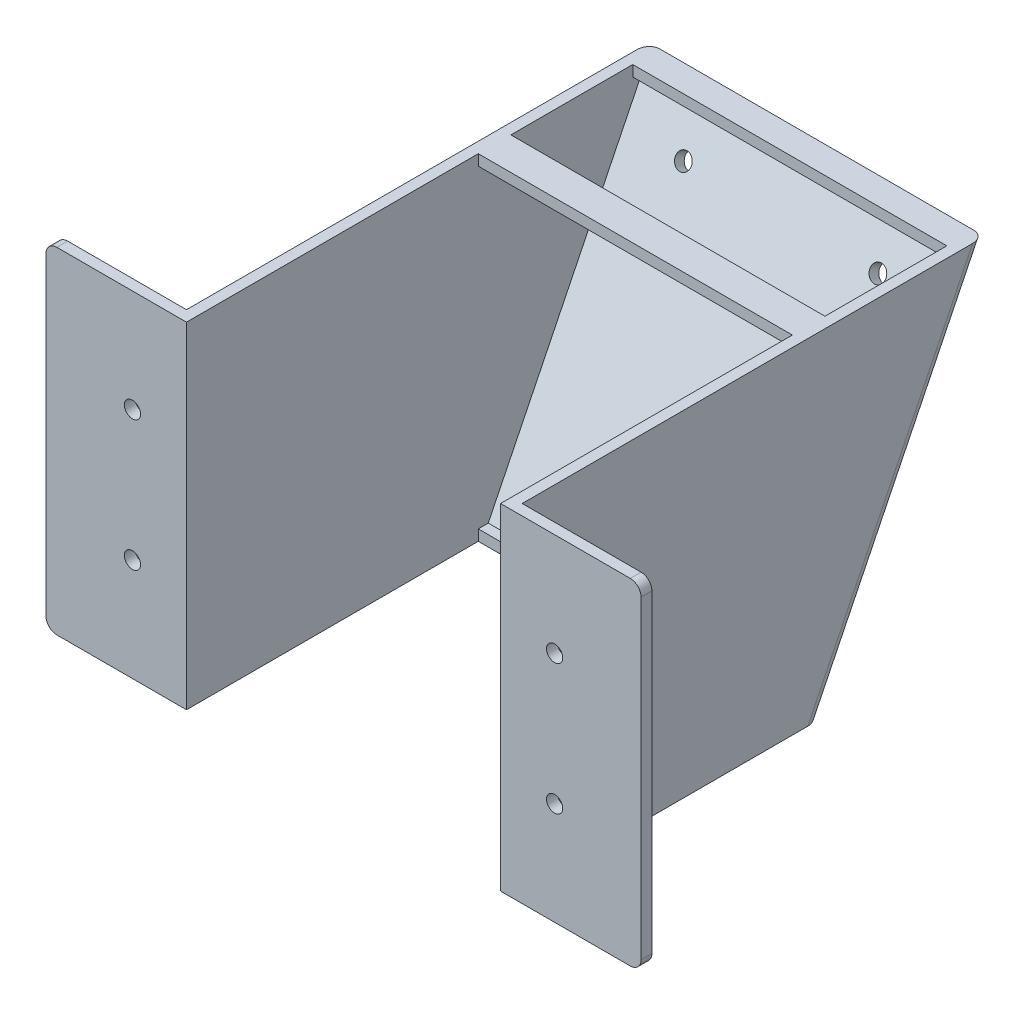
ISO-10303-21;
HEADER;
FILE_DESCRIPTION(('STEP AP214'),'2;1');
FILE_NAME('part.step','',(''),(''),'','','');
FILE_SCHEMA(('AUTOMOTIVE_DESIGN { 1 0 10303 214 1 1 1 1 }'));
ENDSEC;
DATA;
#1=APPLICATION_CONTEXT('core data for automotive mechanical design processes');
#2=APPLICATION_PROTOCOL_DEFINITION('international standard','automotive_design',2000,#1);
#3=PRODUCT_CONTEXT('',#1,'mechanical');
#4=PRODUCT('Part','Part','',(#3));
#5=PRODUCT_RELATED_PRODUCT_CATEGORY('part','',(#4));
#6=PRODUCT_DEFINITION_FORMATION('','',#4);
#7=PRODUCT_DEFINITION_CONTEXT('part definition',#1,'design');
#8=PRODUCT_DEFINITION('design','',#6,#7);
#9=PRODUCT_DEFINITION_SHAPE('','',#8);
#10=(LENGTH_UNIT() NAMED_UNIT(*) SI_UNIT(.MILLI.,.METRE.));
#11=(NAMED_UNIT(*) PLANE_ANGLE_UNIT() SI_UNIT($,.RADIAN.));
#12=(NAMED_UNIT(*) SI_UNIT($,.STERADIAN.) SOLID_ANGLE_UNIT());
#13=UNCERTAINTY_MEASURE_WITH_UNIT(LENGTH_MEASURE(1.E-05),#10,'distance_accuracy_value','');
#14=(GEOMETRIC_REPRESENTATION_CONTEXT(3) GLOBAL_UNCERTAINTY_ASSIGNED_CONTEXT((#13)) GLOBAL_UNIT_ASSIGNED_CONTEXT((#10,
#11,#12)) REPRESENTATION_CONTEXT('',''));
#15=CARTESIAN_POINT('',(0.,0.,0.));
#16=DIRECTION('',(0.,0.,1.));
#17=DIRECTION('',(1.,0.,0.));
#18=AXIS2_PLACEMENT_3D('',#15,#16,#17);
#19=CARTESIAN_POINT('',(-94.6505530644469,29.0633568734212,3.));
#20=DIRECTION('',(0.,-1.,0.));
#21=DIRECTION('',(0.,0.,-1.));
#22=AXIS2_PLACEMENT_3D('',#19,#20,#21);
#23=PLANE('',#22);
#24=DIRECTION('',(-1.,0.,0.));
#25=VECTOR('',#24,1.);
#26=CARTESIAN_POINT('',(-29.0633568734212,29.0633568734212,-25.59));
#27=LINE('',#26,#25);
#28=CARTESIAN_POINT('',(29.0633568734212,29.0633568734212,-25.59));
#29=VERTEX_POINT('',#28);
#30=CARTESIAN_POINT('',(-29.0633568734212,29.0633568734212,-25.59));
#31=VERTEX_POINT('',#30);
#32=EDGE_CURVE('E223',#29,#31,#27,.T.);
#33=ORIENTED_EDGE('',*,*,#32,.T.);
#34=DIRECTION('',(0.,0.,-1.));
#35=VECTOR('',#34,1.);
#36=CARTESIAN_POINT('',(-29.0633568734212,29.0633568734212,3.));
#37=LINE('',#36,#35);
#38=CARTESIAN_POINT('',(-29.0633568734212,29.0633568734212,-27.3803464956001));
#39=VERTEX_POINT('',#38);
#40=EDGE_CURVE('E236',#31,#39,#37,.T.);
#41=ORIENTED_EDGE('',*,*,#40,.T.);
#42=DIRECTION('',(1.,0.,0.));
#43=VECTOR('',#42,1.);
#44=CARTESIAN_POINT('',(-94.6505530644469,29.0633568734212,-27.3803464956001));
#45=LINE('',#44,#43);
#46=CARTESIAN_POINT('',(29.0633568734212,29.0633568734212,-27.3803464956001));
#47=VERTEX_POINT('',#46);
#48=EDGE_CURVE('E255',#39,#47,#45,.T.);
#49=ORIENTED_EDGE('',*,*,#48,.T.);
#50=DIRECTION('',(0.,0.,-1.));
#51=VECTOR('',#50,1.);
#52=CARTESIAN_POINT('',(29.0633568734212,29.0633568734212,3.));
#53=LINE('',#52,#51);
#54=EDGE_CURVE('E254',#29,#47,#53,.T.);
#55=ORIENTED_EDGE('',*,*,#54,.F.);
#56=EDGE_LOOP('',(#33,#41,#49,#55));
#57=FACE_BOUND('',#56,.T.);
#58=ADVANCED_FACE('F37',(#57),#23,.T.);
#59=CARTESIAN_POINT('',(0.,0.,3.));
#60=DIRECTION('',(0.,0.,-1.));
#61=DIRECTION('',(-1.,0.,0.));
#62=AXIS2_PLACEMENT_3D('',#59,#60,#61);
#63=PLANE('',#62);
#64=DIRECTION('',(1.,0.,0.));
#65=VECTOR('',#64,1.);
#66=CARTESIAN_POINT('',(-94.6505530644469,-29.0633568734212,3.));
#67=LINE('',#66,#65);
#68=CARTESIAN_POINT('',(-29.0633568734212,-29.0633568734212,3.));
#69=VERTEX_POINT('',#68);
#70=CARTESIAN_POINT('',(29.0633568734212,-29.0633568734212,3.));
#71=VERTEX_POINT('',#70);
#72=EDGE_CURVE('E251',#69,#71,#67,.T.);
#73=ORIENTED_EDGE('',*,*,#72,.F.);
#74=DIRECTION('',(0.,-1.,0.));
#75=VECTOR('',#74,1.);
#76=CARTESIAN_POINT('',(-29.0633568734212,-31.0633568734212,3.));
#77=LINE('',#76,#75);
#78=CARTESIAN_POINT('',(-29.0633568734212,-31.0633568734212,3.));
#79=VERTEX_POINT('',#78);
#80=EDGE_CURVE('E328',#69,#79,#77,.T.);
#81=ORIENTED_EDGE('',*,*,#80,.T.);
#82=DIRECTION('',(1.,0.,0.));
#83=VECTOR('',#82,1.);
#84=CARTESIAN_POINT('',(29.0633568734212,-31.0633568734212,3.));
#85=LINE('',#84,#83);
#86=CARTESIAN_POINT('',(29.0633568734212,-31.0633568734212,3.));
#87=VERTEX_POINT('',#86);
#88=EDGE_CURVE('E327',#79,#87,#85,.T.);
#89=ORIENTED_EDGE('',*,*,#88,.T.);
#90=DIRECTION('',(0.,1.,0.));
#91=VECTOR('',#90,1.);
#92=CARTESIAN_POINT('',(29.0633568734212,31.0633568734212,3.));
#93=LINE('',#92,#91);
#94=EDGE_CURVE('E332',#87,#71,#93,.T.);
#95=ORIENTED_EDGE('',*,*,#94,.T.);
#96=EDGE_LOOP('',(#73,#81,#89,#95));
#97=FACE_BOUND('',#96,.T.);
#98=ADVANCED_FACE('F456',(#97),#63,.F.);
#99=DIRECTION('',(1.,0.,0.));
#100=VECTOR('',#99,1.);
#101=CARTESIAN_POINT('',(-94.6505530644469,29.0633568734212,3.));
#102=LINE('',#101,#100);
#103=CARTESIAN_POINT('',(-29.0633568734212,29.0633568734212,3.));
#104=VERTEX_POINT('',#103);
#105=CARTESIAN_POINT('',(29.0633568734212,29.0633568734212,3.));
#106=VERTEX_POINT('',#105);
#107=EDGE_CURVE('E234',#104,#106,#102,.T.);
#108=ORIENTED_EDGE('',*,*,#107,.T.);
#109=CARTESIAN_POINT('',(29.0633568734212,31.0633568734212,3.));
#110=VERTEX_POINT('',#109);
#111=EDGE_CURVE('E331',#106,#110,#93,.T.);
#112=ORIENTED_EDGE('',*,*,#111,.T.);
#113=DIRECTION('',(-1.,0.,0.));
#114=VECTOR('',#113,1.);
#115=CARTESIAN_POINT('',(-29.0633568734212,31.0633568734212,3.));
#116=LINE('',#115,#114);
#117=CARTESIAN_POINT('',(-29.0633568734212,31.0633568734212,3.));
#118=VERTEX_POINT('',#117);
#119=EDGE_CURVE('E335',#110,#118,#116,.T.);
#120=ORIENTED_EDGE('',*,*,#119,.T.);
#121=EDGE_CURVE('E325',#118,#104,#77,.T.);
#122=ORIENTED_EDGE('',*,*,#121,.T.);
#123=EDGE_LOOP('',(#108,#112,#120,#122));
#124=FACE_BOUND('',#123,.T.);
#125=ADVANCED_FACE('F462',(#124),#63,.F.);
#126=CARTESIAN_POINT('',(-18.,-17.606648794129,4.43956609068005));
#127=DIRECTION('',(0.,-0.440632808345781,-0.897687433469641));
#128=DIRECTION('',(0.,0.897687433469641,-0.440632808345781));
#129=AXIS2_PLACEMENT_3D('',#126,#127,#128);
#130=CYLINDRICAL_SURFACE('',#129,1.5);
#131=CARTESIAN_POINT('',(-18.,-22.0129768775868,-4.53730824401636));
#132=DIRECTION('',(0.,-0.440632808345781,-0.897687433469641));
#133=DIRECTION('',(0.,0.897687433469641,-0.440632808345781));
#134=AXIS2_PLACEMENT_3D('',#131,#132,#133);
#135=CIRCLE('',#134,1.5);
#136=CARTESIAN_POINT('',(-18.,-20.6664457273823,-5.19825745653503));
#137=VERTEX_POINT('',#136);
#138=EDGE_CURVE('E277',#137,#137,#135,.T.);
#139=ORIENTED_EDGE('',*,*,#138,.T.);
#140=EDGE_LOOP('',(#139));
#141=FACE_BOUND('',#140,.T.);
#142=CARTESIAN_POINT('',(-18.,-21.1317112608952,-2.74193337707708));
#143=DIRECTION('',(0.,0.440632808345781,0.897687433469641));
#144=DIRECTION('',(0.,-0.897687433469641,0.440632808345781));
#145=AXIS2_PLACEMENT_3D('',#142,#143,#144);
#146=CIRCLE('',#145,1.5);
#147=CARTESIAN_POINT('',(-18.,-22.4782424110997,-2.0809841645584));
#148=VERTEX_POINT('',#147);
#149=EDGE_CURVE('E267',#148,#148,#146,.F.);
#150=ORIENTED_EDGE('',*,*,#149,.F.);
#151=EDGE_LOOP('',(#150));
#152=FACE_BOUND('',#151,.T.);
#153=ADVANCED_FACE('F488',(#141,#152),#130,.F.);
#154=CARTESIAN_POINT('',(18.,25.4823480124138,-16.7108087099174));
#155=DIRECTION('',(0.,-0.440632808345781,-0.897687433469641));
#156=DIRECTION('',(0.,0.897687433469641,-0.440632808345781));
#157=AXIS2_PLACEMENT_3D('',#154,#155,#156);
#158=CYLINDRICAL_SURFACE('',#157,1.5);
#159=CARTESIAN_POINT('',(18.,21.076019928956,-25.6876830446138));
#160=DIRECTION('',(0.,-0.440632808345781,-0.897687433469641));
#161=DIRECTION('',(0.,-0.897687433469641,0.440632808345781));
#162=AXIS2_PLACEMENT_3D('',#159,#160,#161);
#163=CIRCLE('',#162,1.5);
#164=CARTESIAN_POINT('',(18.,19.7294887787515,-25.0267338320952));
#165=VERTEX_POINT('',#164);
#166=EDGE_CURVE('E270',#165,#165,#163,.T.);
#167=ORIENTED_EDGE('',*,*,#166,.T.);
#168=EDGE_LOOP('',(#167));
#169=FACE_BOUND('',#168,.T.);
#170=CARTESIAN_POINT('',(18.,21.9572855456475,-23.8923081776746));
#171=DIRECTION('',(0.,0.440632808345781,0.897687433469641));
#172=DIRECTION('',(0.,-0.897687433469641,0.440632808345781));
#173=AXIS2_PLACEMENT_3D('',#170,#171,#172);
#174=CIRCLE('',#173,1.5);
#175=CARTESIAN_POINT('',(18.,20.6107543954431,-23.2313589651559));
#176=VERTEX_POINT('',#175);
#177=EDGE_CURVE('E264',#176,#176,#174,.F.);
#178=ORIENTED_EDGE('',*,*,#177,.F.);
#179=EDGE_LOOP('',(#178));
#180=FACE_BOUND('',#179,.T.);
#181=ADVANCED_FACE('F484',(#169,#180),#158,.F.);
#182=CARTESIAN_POINT('',(-18.,25.4823480124138,-16.7108087099174));
#183=DIRECTION('',(0.,-0.440632808345781,-0.897687433469641));
#184=DIRECTION('',(0.,0.897687433469641,-0.440632808345781));
#185=AXIS2_PLACEMENT_3D('',#182,#183,#184);
#186=CYLINDRICAL_SURFACE('',#185,1.5);
#187=CARTESIAN_POINT('',(-18.,21.076019928956,-25.6876830446138));
#188=DIRECTION('',(0.,-0.440632808345781,-0.897687433469641));
#189=DIRECTION('',(0.,0.897687433469641,-0.440632808345781));
#190=AXIS2_PLACEMENT_3D('',#187,#188,#189);
#191=CIRCLE('',#190,1.5);
#192=CARTESIAN_POINT('',(-18.,22.4225510791604,-26.3486322571325));
#193=VERTEX_POINT('',#192);
#194=EDGE_CURVE('E273',#193,#193,#191,.T.);
#195=ORIENTED_EDGE('',*,*,#194,.T.);
#196=EDGE_LOOP('',(#195));
#197=FACE_BOUND('',#196,.T.);
#198=CARTESIAN_POINT('',(-18.,21.9572855456475,-23.8923081776746));
#199=DIRECTION('',(0.,0.440632808345781,0.897687433469641));
#200=DIRECTION('',(0.,-0.897687433469641,0.440632808345781));
#201=AXIS2_PLACEMENT_3D('',#198,#199,#200);
#202=CIRCLE('',#201,1.5);
#203=CARTESIAN_POINT('',(-18.,20.6107543954431,-23.2313589651559));
#204=VERTEX_POINT('',#203);
#205=EDGE_CURVE('E239',#204,#204,#202,.F.);
#206=ORIENTED_EDGE('',*,*,#205,.F.);
#207=EDGE_LOOP('',(#206));
#208=FACE_BOUND('',#207,.T.);
#209=ADVANCED_FACE('F487',(#197,#208),#186,.F.);
#210=CARTESIAN_POINT('',(18.,-17.606648794129,4.43956609068005));
#211=DIRECTION('',(0.,-0.440632808345781,-0.897687433469641));
#212=DIRECTION('',(0.,0.897687433469641,-0.440632808345781));
#213=AXIS2_PLACEMENT_3D('',#210,#211,#212);
#214=CYLINDRICAL_SURFACE('',#213,1.5);
#215=CARTESIAN_POINT('',(18.,-22.0129768775868,-4.53730824401636));
#216=DIRECTION('',(0.,-0.440632808345781,-0.897687433469641));
#217=DIRECTION('',(0.,-0.897687433469641,0.440632808345781));
#218=AXIS2_PLACEMENT_3D('',#215,#216,#217);
#219=CIRCLE('',#218,1.5);
#220=CARTESIAN_POINT('',(18.,-23.3595080277913,-3.87635903149769));
#221=VERTEX_POINT('',#220);
#222=EDGE_CURVE('E274',#221,#221,#219,.T.);
#223=ORIENTED_EDGE('',*,*,#222,.T.);
#224=EDGE_LOOP('',(#223));
#225=FACE_BOUND('',#224,.T.);
#226=CARTESIAN_POINT('',(18.,-21.1317112608952,-2.74193337707708));
#227=DIRECTION('',(0.,0.440632808345781,0.897687433469641));
#228=DIRECTION('',(0.,-0.897687433469641,0.440632808345781));
#229=AXIS2_PLACEMENT_3D('',#226,#227,#228);
#230=CIRCLE('',#229,1.5);
#231=CARTESIAN_POINT('',(18.,-22.4782424110997,-2.08098416455841));
#232=VERTEX_POINT('',#231);
#233=EDGE_CURVE('E235',#232,#232,#230,.F.);
#234=ORIENTED_EDGE('',*,*,#233,.F.);
#235=EDGE_LOOP('',(#234));
#236=FACE_BOUND('',#235,.T.);
#237=ADVANCED_FACE('F490',(#225,#236),#214,.F.);
#238=CARTESIAN_POINT('',(-31.0633568734212,31.0633568734212,57.));
#239=DIRECTION('',(1.,0.,0.));
#240=DIRECTION('',(0.,0.,-1.));
#241=AXIS2_PLACEMENT_3D('',#238,#239,#240);
#242=PLANE('',#241);
#243=DIRECTION('',(0.,0.,-1.));
#244=VECTOR('',#243,1.);
#245=CARTESIAN_POINT('',(-31.0633568734212,31.0633568734212,57.));
#246=LINE('',#245,#244);
#247=CARTESIAN_POINT('',(-31.0633568734212,31.0633568734212,55.));
#248=VERTEX_POINT('',#247);
#249=CARTESIAN_POINT('',(-31.0633568734212,31.0633568734212,-28.3620530271101));
#250=VERTEX_POINT('',#249);
#251=EDGE_CURVE('E363',#248,#250,#246,.T.);
#252=ORIENTED_EDGE('',*,*,#251,.T.);
#253=DIRECTION('',(0.,-0.897687433469641,0.440632808345781));
#254=VECTOR('',#253,1.);
#255=CARTESIAN_POINT('',(-31.0633568734212,-2.70164885533545,-11.7883896969142));
#256=LINE('',#255,#254);
#257=CARTESIAN_POINT('',(-31.0633568734212,-31.0633568734212,2.13304730615246));
#258=VERTEX_POINT('',#257);
#259=EDGE_CURVE('E415',#250,#258,#256,.T.);
#260=ORIENTED_EDGE('',*,*,#259,.T.);
#261=DIRECTION('',(0.,0.,-1.));
#262=VECTOR('',#261,1.);
#263=CARTESIAN_POINT('',(-31.0633568734212,-31.0633568734212,57.));
#264=LINE('',#263,#262);
#265=CARTESIAN_POINT('',(-31.0633568734212,-31.0633568734212,55.));
#266=VERTEX_POINT('',#265);
#267=EDGE_CURVE('E360',#266,#258,#264,.T.);
#268=ORIENTED_EDGE('',*,*,#267,.F.);
#269=DIRECTION('',(0.,-1.,0.));
#270=VECTOR('',#269,1.);
#271=CARTESIAN_POINT('',(-31.0633568734212,-31.0633568734212,55.));
#272=LINE('',#271,#270);
#273=EDGE_CURVE('E302',#248,#266,#272,.T.);
#274=ORIENTED_EDGE('',*,*,#273,.F.);
#275=EDGE_LOOP('',(#252,#260,#268,#274));
#276=FACE_BOUND('',#275,.T.);
#277=ADVANCED_FACE('F444',(#276),#242,.F.);
#278=CARTESIAN_POINT('',(31.0633568734212,31.0633568734212,57.));
#279=DIRECTION('',(-1.,0.,0.));
#280=DIRECTION('',(0.,0.,1.));
#281=AXIS2_PLACEMENT_3D('',#278,#279,#280);
#282=PLANE('',#281);
#283=DIRECTION('',(0.,0.,-1.));
#284=VECTOR('',#283,1.);
#285=CARTESIAN_POINT('',(31.0633568734212,-31.0633568734212,57.));
#286=LINE('',#285,#284);
#287=CARTESIAN_POINT('',(31.0633568734212,-31.0633568734212,55.));
#288=VERTEX_POINT('',#287);
#289=CARTESIAN_POINT('',(31.0633568734212,-31.0633568734212,2.13304730615247));
#290=VERTEX_POINT('',#289);
#291=EDGE_CURVE('E358',#288,#290,#286,.T.);
#292=ORIENTED_EDGE('',*,*,#291,.T.);
#293=DIRECTION('',(0.,-0.897687433469641,0.440632808345781));
#294=VECTOR('',#293,1.);
#295=CARTESIAN_POINT('',(31.0633568734212,-2.70164885533545,-11.7883896969142));
#296=LINE('',#295,#294);
#297=CARTESIAN_POINT('',(31.0633568734212,31.0633568734212,-28.3620530271101));
#298=VERTEX_POINT('',#297);
#299=EDGE_CURVE('E45',#290,#298,#296,.F.);
#300=ORIENTED_EDGE('',*,*,#299,.T.);
#301=DIRECTION('',(0.,0.,-1.));
#302=VECTOR('',#301,1.);
#303=CARTESIAN_POINT('',(31.0633568734212,31.0633568734212,57.));
#304=LINE('',#303,#302);
#305=CARTESIAN_POINT('',(31.0633568734212,31.0633568734212,55.));
#306=VERTEX_POINT('',#305);
#307=EDGE_CURVE('E366',#306,#298,#304,.T.);
#308=ORIENTED_EDGE('',*,*,#307,.F.);
#309=DIRECTION('',(0.,1.,0.));
#310=VECTOR('',#309,1.);
#311=CARTESIAN_POINT('',(31.0633568734212,31.0633568734212,55.));
#312=LINE('',#311,#310);
#313=EDGE_CURVE('E312',#288,#306,#312,.T.);
#314=ORIENTED_EDGE('',*,*,#313,.F.);
#315=EDGE_LOOP('',(#292,#300,#308,#314));
#316=FACE_BOUND('',#315,.T.);
#317=ADVANCED_FACE('F552',(#316),#282,.F.);
#318=CARTESIAN_POINT('',(0.,0.,57.));
#319=DIRECTION('',(0.,0.,1.));
#320=DIRECTION('',(1.,0.,0.));
#321=AXIS2_PLACEMENT_3D('',#318,#319,#320);
#322=PLANE('',#321);
#323=CARTESIAN_POINT('',(-39.0633568734212,12.0633568734212,57.));
#324=DIRECTION('',(0.,0.,1.));
#325=DIRECTION('',(-1.,0.,0.));
#326=AXIS2_PLACEMENT_3D('',#323,#324,#325);
#327=CIRCLE('',#326,1.5);
#328=CARTESIAN_POINT('',(-40.5633568734212,12.0633568734212,57.));
#329=VERTEX_POINT('',#328);
#330=EDGE_CURVE('E290',#329,#329,#327,.T.);
#331=ORIENTED_EDGE('',*,*,#330,.F.);
#332=EDGE_LOOP('',(#331));
#333=FACE_BOUND('',#332,.T.);
#334=CARTESIAN_POINT('',(-39.0633568734212,-12.0633568734212,57.));
#335=DIRECTION('',(0.,0.,1.));
#336=DIRECTION('',(1.,0.,0.));
#337=AXIS2_PLACEMENT_3D('',#334,#335,#336);
#338=CIRCLE('',#337,1.5);
#339=CARTESIAN_POINT('',(-37.5633568734212,-12.0633568734212,57.));
#340=VERTEX_POINT('',#339);
#341=EDGE_CURVE('E286',#340,#340,#338,.T.);
#342=ORIENTED_EDGE('',*,*,#341,.F.);
#343=EDGE_LOOP('',(#342));
#344=FACE_BOUND('',#343,.T.);
#345=DIRECTION('',(-1.,0.,0.));
#346=VECTOR('',#345,1.);
#347=CARTESIAN_POINT('',(-31.0633568734212,31.0633568734212,57.));
#348=LINE('',#347,#346);
#349=CARTESIAN_POINT('',(-29.0633568734212,31.0633568734212,57.));
#350=VERTEX_POINT('',#349);
#351=CARTESIAN_POINT('',(-53.0633568734212,31.0633568734212,57.));
#352=VERTEX_POINT('',#351);
#353=EDGE_CURVE('E345',#350,#352,#348,.T.);
#354=ORIENTED_EDGE('',*,*,#353,.T.);
#355=CARTESIAN_POINT('',(-53.0633568734212,29.0633568734212,57.));
#356=DIRECTION('',(0.,0.,1.));
#357=DIRECTION('',(1.,0.,0.));
#358=AXIS2_PLACEMENT_3D('',#355,#356,#357);
#359=CIRCLE('',#358,2.);
#360=CARTESIAN_POINT('',(-55.0633568734212,29.0633568734212,57.));
#361=VERTEX_POINT('',#360);
#362=EDGE_CURVE('E414',#352,#361,#359,.T.);
#363=ORIENTED_EDGE('',*,*,#362,.T.);
#364=DIRECTION('',(0.,1.,0.));
#365=VECTOR('',#364,1.);
#366=CARTESIAN_POINT('',(-55.0633568734212,31.0633568734212,57.));
#367=LINE('',#366,#365);
#368=CARTESIAN_POINT('',(-55.0633568734212,-29.0633568734212,57.));
#369=VERTEX_POINT('',#368);
#370=EDGE_CURVE('E301',#369,#361,#367,.T.);
#371=ORIENTED_EDGE('',*,*,#370,.F.);
#372=CARTESIAN_POINT('',(-53.0633568734212,-29.0633568734212,57.));
#373=DIRECTION('',(0.,0.,1.));
#374=DIRECTION('',(1.,0.,0.));
#375=AXIS2_PLACEMENT_3D('',#372,#373,#374);
#376=CIRCLE('',#375,2.);
#377=CARTESIAN_POINT('',(-53.0633568734212,-31.0633568734212,57.));
#378=VERTEX_POINT('',#377);
#379=EDGE_CURVE('E400',#369,#378,#376,.T.);
#380=ORIENTED_EDGE('',*,*,#379,.T.);
#381=DIRECTION('',(1.,0.,0.));
#382=VECTOR('',#381,1.);
#383=CARTESIAN_POINT('',(-31.0633568734212,-31.0633568734212,57.));
#384=LINE('',#383,#382);
#385=CARTESIAN_POINT('',(-29.0633568734212,-31.0633568734212,57.));
#386=VERTEX_POINT('',#385);
#387=EDGE_CURVE('E356',#378,#386,#384,.T.);
#388=ORIENTED_EDGE('',*,*,#387,.T.);
#389=DIRECTION('',(0.,-1.,0.));
#390=VECTOR('',#389,1.);
#391=CARTESIAN_POINT('',(-29.0633568734212,-31.0633568734212,57.));
#392=LINE('',#391,#390);
#393=EDGE_CURVE('E324',#350,#386,#392,.T.);
#394=ORIENTED_EDGE('',*,*,#393,.F.);
#395=EDGE_LOOP('',(#354,#363,#371,#380,#388,#394));
#396=FACE_BOUND('',#395,.T.);
#397=ADVANCED_FACE('F547',(#333,#344,#396),#322,.T.);
#398=CARTESIAN_POINT('',(-31.0633568734212,31.0633568734212,57.));
#399=DIRECTION('',(0.,-1.,0.));
#400=DIRECTION('',(0.,0.,-1.));
#401=AXIS2_PLACEMENT_3D('',#398,#399,#400);
#402=PLANE('',#401);
#403=DIRECTION('',(1.,0.,0.));
#404=VECTOR('',#403,1.);
#405=CARTESIAN_POINT('',(29.0633568734212,31.0633568734212,-3.03020841788992));
#406=LINE('',#405,#404);
#407=CARTESIAN_POINT('',(-29.0633568734212,31.0633568734212,-3.03020841788992));
#408=VERTEX_POINT('',#407);
#409=CARTESIAN_POINT('',(29.0633568734212,31.0633568734212,-3.03020841788992));
#410=VERTEX_POINT('',#409);
#411=EDGE_CURVE('E632',#408,#410,#406,.T.);
#412=ORIENTED_EDGE('',*,*,#411,.F.);
#413=DIRECTION('',(0.,0.,1.));
#414=VECTOR('',#413,1.);
#415=CARTESIAN_POINT('',(-29.0633568734212,31.0633568734212,-3.03020841788992));
#416=LINE('',#415,#414);
#417=CARTESIAN_POINT('',(-29.0633568734212,31.0633568734212,-25.59));
#418=VERTEX_POINT('',#417);
#419=EDGE_CURVE('E218',#418,#408,#416,.T.);
#420=ORIENTED_EDGE('',*,*,#419,.F.);
#421=DIRECTION('',(-1.,0.,0.));
#422=VECTOR('',#421,1.);
#423=CARTESIAN_POINT('',(-29.0633568734212,31.0633568734212,-25.59));
#424=LINE('',#423,#422);
#425=CARTESIAN_POINT('',(29.0633568734212,31.0633568734212,-25.59));
#426=VERTEX_POINT('',#425);
#427=EDGE_CURVE('E230',#426,#418,#424,.T.);
#428=ORIENTED_EDGE('',*,*,#427,.F.);
#429=DIRECTION('',(0.,0.,-1.));
#430=VECTOR('',#429,1.);
#431=CARTESIAN_POINT('',(29.0633568734212,31.0633568734212,-25.59));
#432=LINE('',#431,#430);
#433=EDGE_CURVE('E630',#410,#426,#432,.T.);
#434=ORIENTED_EDGE('',*,*,#433,.F.);
#435=EDGE_LOOP('',(#412,#420,#428,#434));
#436=FACE_BOUND('',#435,.T.);
#437=ORIENTED_EDGE('',*,*,#307,.T.);
#438=CARTESIAN_POINT('',(29.0633568734212,31.0633568734212,-28.3620530271101));
#439=DIRECTION('',(0.,-1.,0.));
#440=DIRECTION('',(0.,0.,1.));
#441=AXIS2_PLACEMENT_3D('',#438,#439,#440);
#442=ELLIPSE('',#441,2.22794697288991,2.);
#443=CARTESIAN_POINT('',(29.0633568734212,31.0633568734212,-30.59));
#444=VERTEX_POINT('',#443);
#445=EDGE_CURVE('E11',#298,#444,#442,.F.);
#446=ORIENTED_EDGE('',*,*,#445,.T.);
#447=DIRECTION('',(-1.,0.,0.));
#448=VECTOR('',#447,1.);
#449=CARTESIAN_POINT('',(-31.0633568734212,31.0633568734212,-30.59));
#450=LINE('',#449,#448);
#451=CARTESIAN_POINT('',(-29.0633568734212,31.0633568734212,-30.59));
#452=VERTEX_POINT('',#451);
#453=EDGE_CURVE('E284',#444,#452,#450,.T.);
#454=ORIENTED_EDGE('',*,*,#453,.T.);
#455=CARTESIAN_POINT('',(-29.0633568734212,31.0633568734212,-28.3620530271101));
#456=DIRECTION('',(0.,-1.,0.));
#457=DIRECTION('',(0.,0.,1.));
#458=AXIS2_PLACEMENT_3D('',#455,#456,#457);
#459=ELLIPSE('',#458,2.22794697288991,2.);
#460=EDGE_CURVE('E424',#452,#250,#459,.F.);
#461=ORIENTED_EDGE('',*,*,#460,.T.);
#462=ORIENTED_EDGE('',*,*,#251,.F.);
#463=DIRECTION('',(1.,0.,0.));
#464=VECTOR('',#463,1.);
#465=CARTESIAN_POINT('',(-55.0633568734212,31.0633568734212,55.));
#466=LINE('',#465,#464);
#467=CARTESIAN_POINT('',(-53.0633568734212,31.0633568734212,55.));
#468=VERTEX_POINT('',#467);
#469=EDGE_CURVE('E305',#468,#248,#466,.T.);
#470=ORIENTED_EDGE('',*,*,#469,.F.);
#471=DIRECTION('',(0.,0.,-1.));
#472=VECTOR('',#471,1.);
#473=CARTESIAN_POINT('',(-53.0633568734212,31.0633568734212,57.));
#474=LINE('',#473,#472);
#475=EDGE_CURVE('E412',#468,#352,#474,.F.);
#476=ORIENTED_EDGE('',*,*,#475,.T.);
#477=ORIENTED_EDGE('',*,*,#353,.F.);
#478=DIRECTION('',(0.,0.,1.));
#479=VECTOR('',#478,1.);
#480=CARTESIAN_POINT('',(-29.0633568734212,31.0633568734212,3.));
#481=LINE('',#480,#479);
#482=EDGE_CURVE('E343',#118,#350,#481,.T.);
#483=ORIENTED_EDGE('',*,*,#482,.F.);
#484=ORIENTED_EDGE('',*,*,#119,.F.);
#485=DIRECTION('',(0.,0.,1.));
#486=VECTOR('',#485,1.);
#487=CARTESIAN_POINT('',(29.0633568734212,31.0633568734212,3.));
#488=LINE('',#487,#486);
#489=CARTESIAN_POINT('',(29.0633568734212,31.0633568734212,57.));
#490=VERTEX_POINT('',#489);
#491=EDGE_CURVE('E346',#110,#490,#488,.T.);
#492=ORIENTED_EDGE('',*,*,#491,.T.);
#493=CARTESIAN_POINT('',(53.0633568734212,31.0633568734212,57.));
#494=VERTEX_POINT('',#493);
#495=EDGE_CURVE('E353',#494,#490,#348,.T.);
#496=ORIENTED_EDGE('',*,*,#495,.F.);
#497=DIRECTION('',(0.,0.,1.));
#498=VECTOR('',#497,1.);
#499=CARTESIAN_POINT('',(53.0633568734212,31.0633568734212,57.));
#500=LINE('',#499,#498);
#501=CARTESIAN_POINT('',(53.0633568734212,31.0633568734212,55.));
#502=VERTEX_POINT('',#501);
#503=EDGE_CURVE('E393',#494,#502,#500,.F.);
#504=ORIENTED_EDGE('',*,*,#503,.T.);
#505=DIRECTION('',(-1.,0.,0.));
#506=VECTOR('',#505,1.);
#507=CARTESIAN_POINT('',(55.0633568734212,31.0633568734212,55.));
#508=LINE('',#507,#506);
#509=EDGE_CURVE('E318',#502,#306,#508,.T.);
#510=ORIENTED_EDGE('',*,*,#509,.T.);
#511=EDGE_LOOP('',(#437,#446,#454,#461,#462,#470,#476,#477,#483,#484,#492,#496,#504,#510));
#512=FACE_BOUND('',#511,.T.);
#513=ADVANCED_FACE('F449',(#436,#512),#402,.F.);
#514=CARTESIAN_POINT('',(-31.0633568734212,-31.0633568734212,57.));
#515=DIRECTION('',(0.,1.,0.));
#516=DIRECTION('',(0.,0.,1.));
#517=AXIS2_PLACEMENT_3D('',#514,#515,#516);
#518=PLANE('',#517);
#519=DIRECTION('',(1.,0.,0.));
#520=VECTOR('',#519,1.);
#521=CARTESIAN_POINT('',(-31.0633568734212,-31.0633568734212,-0.0948996667374732));
#522=LINE('',#521,#520);
#523=CARTESIAN_POINT('',(-29.0633568734212,-31.0633568734212,-0.0948996667374732));
#524=VERTEX_POINT('',#523);
#525=CARTESIAN_POINT('',(29.0633568734212,-31.0633568734212,-0.0948996667374732));
#526=VERTEX_POINT('',#525);
#527=EDGE_CURVE('E282',#524,#526,#522,.T.);
#528=ORIENTED_EDGE('',*,*,#527,.T.);
#529=CARTESIAN_POINT('',(29.0633568734212,-31.0633568734212,2.13304730615245));
#530=DIRECTION('',(0.,1.,0.));
#531=DIRECTION('',(0.,0.,1.));
#532=AXIS2_PLACEMENT_3D('',#529,#530,#531);
#533=ELLIPSE('',#532,2.22794697288991,2.);
#534=EDGE_CURVE('E59',#526,#290,#533,.F.);
#535=ORIENTED_EDGE('',*,*,#534,.T.);
#536=ORIENTED_EDGE('',*,*,#291,.F.);
#537=DIRECTION('',(-1.,0.,0.));
#538=VECTOR('',#537,1.);
#539=CARTESIAN_POINT('',(55.0633568734212,-31.0633568734212,55.));
#540=LINE('',#539,#538);
#541=CARTESIAN_POINT('',(53.0633568734212,-31.0633568734212,55.));
#542=VERTEX_POINT('',#541);
#543=EDGE_CURVE('E322',#542,#288,#540,.T.);
#544=ORIENTED_EDGE('',*,*,#543,.F.);
#545=DIRECTION('',(0.,0.,-1.));
#546=VECTOR('',#545,1.);
#547=CARTESIAN_POINT('',(53.0633568734212,-31.0633568734212,57.));
#548=LINE('',#547,#546);
#549=CARTESIAN_POINT('',(53.0633568734212,-31.0633568734212,57.));
#550=VERTEX_POINT('',#549);
#551=EDGE_CURVE('E383',#542,#550,#548,.F.);
#552=ORIENTED_EDGE('',*,*,#551,.T.);
#553=CARTESIAN_POINT('',(29.0633568734212,-31.0633568734212,57.));
#554=VERTEX_POINT('',#553);
#555=EDGE_CURVE('E355',#554,#550,#384,.T.);
#556=ORIENTED_EDGE('',*,*,#555,.F.);
#557=DIRECTION('',(0.,0.,1.));
#558=VECTOR('',#557,1.);
#559=CARTESIAN_POINT('',(29.0633568734212,-31.0633568734212,3.));
#560=LINE('',#559,#558);
#561=EDGE_CURVE('E349',#87,#554,#560,.T.);
#562=ORIENTED_EDGE('',*,*,#561,.F.);
#563=ORIENTED_EDGE('',*,*,#88,.F.);
#564=DIRECTION('',(0.,0.,1.));
#565=VECTOR('',#564,1.);
#566=CARTESIAN_POINT('',(-29.0633568734212,-31.0633568734212,3.));
#567=LINE('',#566,#565);
#568=EDGE_CURVE('E338',#79,#386,#567,.T.);
#569=ORIENTED_EDGE('',*,*,#568,.T.);
#570=ORIENTED_EDGE('',*,*,#387,.F.);
#571=DIRECTION('',(0.,0.,1.));
#572=VECTOR('',#571,1.);
#573=CARTESIAN_POINT('',(-53.0633568734212,-31.0633568734212,57.));
#574=LINE('',#573,#572);
#575=CARTESIAN_POINT('',(-53.0633568734212,-31.0633568734212,55.));
#576=VERTEX_POINT('',#575);
#577=EDGE_CURVE('E402',#378,#576,#574,.F.);
#578=ORIENTED_EDGE('',*,*,#577,.T.);
#579=DIRECTION('',(1.,0.,0.));
#580=VECTOR('',#579,1.);
#581=CARTESIAN_POINT('',(-55.0633568734212,-31.0633568734212,55.));
#582=LINE('',#581,#580);
#583=EDGE_CURVE('E310',#576,#266,#582,.T.);
#584=ORIENTED_EDGE('',*,*,#583,.T.);
#585=ORIENTED_EDGE('',*,*,#267,.T.);
#586=CARTESIAN_POINT('',(-29.0633568734212,-31.0633568734212,2.13304730615245));
#587=DIRECTION('',(0.,1.,0.));
#588=DIRECTION('',(0.,0.,1.));
#589=AXIS2_PLACEMENT_3D('',#586,#587,#588);
#590=ELLIPSE('',#589,2.22794697288991,2.);
#591=EDGE_CURVE('E419',#258,#524,#590,.F.);
#592=ORIENTED_EDGE('',*,*,#591,.T.);
#593=EDGE_LOOP('',(#528,#535,#536,#544,#552,#556,#562,#563,#569,#570,#578,#584,#585,#592));
#594=FACE_BOUND('',#593,.T.);
#595=ADVANCED_FACE('F437',(#594),#518,.F.);
#596=CARTESIAN_POINT('',(39.0633568734212,-12.0633568734212,57.));
#597=DIRECTION('',(0.,0.,1.));
#598=DIRECTION('',(-1.,0.,0.));
#599=AXIS2_PLACEMENT_3D('',#596,#597,#598);
#600=CIRCLE('',#599,1.5);
#601=CARTESIAN_POINT('',(37.5633568734212,-12.0633568734212,57.));
#602=VERTEX_POINT('',#601);
#603=EDGE_CURVE('E289',#602,#602,#600,.T.);
#604=ORIENTED_EDGE('',*,*,#603,.F.);
#605=EDGE_LOOP('',(#604));
#606=FACE_BOUND('',#605,.T.);
#607=CARTESIAN_POINT('',(39.0633568734212,12.0633568734212,57.));
#608=DIRECTION('',(0.,0.,1.));
#609=DIRECTION('',(1.,0.,0.));
#610=AXIS2_PLACEMENT_3D('',#607,#608,#609);
#611=CIRCLE('',#610,1.5);
#612=CARTESIAN_POINT('',(40.5633568734212,12.0633568734212,57.));
#613=VERTEX_POINT('',#612);
#614=EDGE_CURVE('E293',#613,#613,#611,.T.);
#615=ORIENTED_EDGE('',*,*,#614,.F.);
#616=EDGE_LOOP('',(#615));
#617=FACE_BOUND('',#616,.T.);
#618=DIRECTION('',(0.,-1.,0.));
#619=VECTOR('',#618,1.);
#620=CARTESIAN_POINT('',(55.0633568734212,-31.0633568734212,57.));
#621=LINE('',#620,#619);
#622=CARTESIAN_POINT('',(55.0633568734212,29.0633568734212,57.));
#623=VERTEX_POINT('',#622);
#624=CARTESIAN_POINT('',(55.0633568734212,-29.0633568734212,57.));
#625=VERTEX_POINT('',#624);
#626=EDGE_CURVE('E313',#623,#625,#621,.T.);
#627=ORIENTED_EDGE('',*,*,#626,.F.);
#628=CARTESIAN_POINT('',(53.0633568734212,29.0633568734212,57.));
#629=DIRECTION('',(0.,0.,1.));
#630=DIRECTION('',(1.,0.,0.));
#631=AXIS2_PLACEMENT_3D('',#628,#629,#630);
#632=CIRCLE('',#631,2.);
#633=EDGE_CURVE('E391',#623,#494,#632,.T.);
#634=ORIENTED_EDGE('',*,*,#633,.T.);
#635=ORIENTED_EDGE('',*,*,#495,.T.);
#636=DIRECTION('',(0.,1.,0.));
#637=VECTOR('',#636,1.);
#638=CARTESIAN_POINT('',(29.0633568734212,31.0633568734212,57.));
#639=LINE('',#638,#637);
#640=EDGE_CURVE('E340',#554,#490,#639,.T.);
#641=ORIENTED_EDGE('',*,*,#640,.F.);
#642=ORIENTED_EDGE('',*,*,#555,.T.);
#643=CARTESIAN_POINT('',(53.0633568734212,-29.0633568734212,57.));
#644=DIRECTION('',(0.,0.,1.));
#645=DIRECTION('',(1.,0.,0.));
#646=AXIS2_PLACEMENT_3D('',#643,#644,#645);
#647=CIRCLE('',#646,2.);
#648=EDGE_CURVE('E385',#550,#625,#647,.T.);
#649=ORIENTED_EDGE('',*,*,#648,.T.);
#650=EDGE_LOOP('',(#627,#634,#635,#641,#642,#649));
#651=FACE_BOUND('',#650,.T.);
#652=ADVANCED_FACE('F543',(#606,#617,#651),#322,.T.);
#653=CARTESIAN_POINT('',(-29.0633568734212,-31.0633568734212,3.));
#654=DIRECTION('',(-1.,0.,0.));
#655=DIRECTION('',(0.,-1.,0.));
#656=AXIS2_PLACEMENT_3D('',#653,#654,#655);
#657=PLANE('',#656);
#658=ORIENTED_EDGE('',*,*,#393,.T.);
#659=ORIENTED_EDGE('',*,*,#568,.F.);
#660=ORIENTED_EDGE('',*,*,#80,.F.);
#661=DIRECTION('',(0.,0.,1.));
#662=VECTOR('',#661,1.);
#663=CARTESIAN_POINT('',(-29.0633568734212,-29.0633568734212,1.15134077464248));
#664=LINE('',#663,#662);
#665=CARTESIAN_POINT('',(-29.0633568734212,-29.0633568734212,1.15134077464248));
#666=VERTEX_POINT('',#665);
#667=EDGE_CURVE('E241',#666,#69,#664,.T.);
#668=ORIENTED_EDGE('',*,*,#667,.F.);
#669=DIRECTION('',(0.,-0.897687433469641,0.440632808345781));
#670=VECTOR('',#669,1.);
#671=CARTESIAN_POINT('',(-29.0633568734212,29.0633568734212,-27.3803464956001));
#672=LINE('',#671,#670);
#673=EDGE_CURVE('E247',#39,#666,#672,.T.);
#674=ORIENTED_EDGE('',*,*,#673,.F.);
#675=ORIENTED_EDGE('',*,*,#40,.F.);
#676=DIRECTION('',(0.,1.,0.));
#677=VECTOR('',#676,1.);
#678=CARTESIAN_POINT('',(-29.0633568734212,29.0633568734212,-25.59));
#679=LINE('',#678,#677);
#680=EDGE_CURVE('E261',#31,#418,#679,.T.);
#681=ORIENTED_EDGE('',*,*,#680,.T.);
#682=ORIENTED_EDGE('',*,*,#419,.T.);
#683=DIRECTION('',(0.,1.,0.));
#684=VECTOR('',#683,1.);
#685=CARTESIAN_POINT('',(-29.0633568734212,29.0633568734212,-3.03020841788992));
#686=LINE('',#685,#684);
#687=CARTESIAN_POINT('',(-29.0633568734212,29.0633568734212,-3.03020841788992));
#688=VERTEX_POINT('',#687);
#689=EDGE_CURVE('E210',#688,#408,#686,.T.);
#690=ORIENTED_EDGE('',*,*,#689,.F.);
#691=EDGE_CURVE('E215',#104,#688,#37,.T.);
#692=ORIENTED_EDGE('',*,*,#691,.F.);
#693=ORIENTED_EDGE('',*,*,#121,.F.);
#694=ORIENTED_EDGE('',*,*,#482,.T.);
#695=EDGE_LOOP('',(#658,#659,#660,#668,#674,#675,#681,#682,#690,#692,#693,#694));
#696=FACE_BOUND('',#695,.T.);
#697=ADVANCED_FACE('F213',(#696),#657,.F.);
#698=CARTESIAN_POINT('',(29.0633568734212,31.0633568734212,3.));
#699=DIRECTION('',(1.,0.,0.));
#700=DIRECTION('',(0.,1.,0.));
#701=AXIS2_PLACEMENT_3D('',#698,#699,#700);
#702=PLANE('',#701);
#703=ORIENTED_EDGE('',*,*,#640,.T.);
#704=ORIENTED_EDGE('',*,*,#491,.F.);
#705=ORIENTED_EDGE('',*,*,#111,.F.);
#706=CARTESIAN_POINT('',(29.0633568734212,29.0633568734212,-3.03020841788992));
#707=VERTEX_POINT('',#706);
#708=EDGE_CURVE('E258',#106,#707,#53,.T.);
#709=ORIENTED_EDGE('',*,*,#708,.T.);
#710=DIRECTION('',(0.,1.,0.));
#711=VECTOR('',#710,1.);
#712=CARTESIAN_POINT('',(29.0633568734212,29.0633568734212,-3.03020841788992));
#713=LINE('',#712,#711);
#714=EDGE_CURVE('E222',#707,#410,#713,.T.);
#715=ORIENTED_EDGE('',*,*,#714,.T.);
#716=ORIENTED_EDGE('',*,*,#433,.T.);
#717=DIRECTION('',(0.,1.,0.));
#718=VECTOR('',#717,1.);
#719=CARTESIAN_POINT('',(29.0633568734212,29.0633568734212,-25.59));
#720=LINE('',#719,#718);
#721=EDGE_CURVE('E625',#29,#426,#720,.T.);
#722=ORIENTED_EDGE('',*,*,#721,.F.);
#723=ORIENTED_EDGE('',*,*,#54,.T.);
#724=DIRECTION('',(0.,-0.897687433469641,0.440632808345781));
#725=VECTOR('',#724,1.);
#726=CARTESIAN_POINT('',(29.0633568734212,29.0633568734212,-27.3803464956001));
#727=LINE('',#726,#725);
#728=CARTESIAN_POINT('',(29.0633568734212,-29.0633568734212,1.15134077464248));
#729=VERTEX_POINT('',#728);
#730=EDGE_CURVE('E250',#47,#729,#727,.T.);
#731=ORIENTED_EDGE('',*,*,#730,.T.);
#732=DIRECTION('',(0.,0.,1.));
#733=VECTOR('',#732,1.);
#734=CARTESIAN_POINT('',(29.0633568734212,-29.0633568734212,1.15134077464248));
#735=LINE('',#734,#733);
#736=EDGE_CURVE('E244',#729,#71,#735,.T.);
#737=ORIENTED_EDGE('',*,*,#736,.T.);
#738=ORIENTED_EDGE('',*,*,#94,.F.);
#739=ORIENTED_EDGE('',*,*,#561,.T.);
#740=EDGE_LOOP('',(#703,#704,#705,#709,#715,#716,#722,#723,#731,#737,#738,#739));
#741=FACE_BOUND('',#740,.T.);
#742=ADVANCED_FACE('F535',(#741),#702,.F.);
#743=CARTESIAN_POINT('',(55.0633568734212,31.0633568734212,55.));
#744=DIRECTION('',(0.,0.,1.));
#745=DIRECTION('',(0.,-1.,0.));
#746=AXIS2_PLACEMENT_3D('',#743,#744,#745);
#747=PLANE('',#746);
#748=CARTESIAN_POINT('',(39.0633568734212,-12.0633568734212,55.));
#749=DIRECTION('',(0.,0.,1.));
#750=DIRECTION('',(0.,-1.,0.));
#751=AXIS2_PLACEMENT_3D('',#748,#749,#750);
#752=CIRCLE('',#751,1.5);
#753=CARTESIAN_POINT('',(39.0633568734212,-13.5633568734212,55.));
#754=VERTEX_POINT('',#753);
#755=EDGE_CURVE('E308',#754,#754,#752,.T.);
#756=ORIENTED_EDGE('',*,*,#755,.T.);
#757=EDGE_LOOP('',(#756));
#758=FACE_BOUND('',#757,.T.);
#759=CARTESIAN_POINT('',(39.0633568734212,12.0633568734212,55.));
#760=DIRECTION('',(0.,0.,1.));
#761=DIRECTION('',(0.,-1.,0.));
#762=AXIS2_PLACEMENT_3D('',#759,#760,#761);
#763=CIRCLE('',#762,1.5);
#764=CARTESIAN_POINT('',(39.0633568734212,10.5633568734212,55.));
#765=VERTEX_POINT('',#764);
#766=EDGE_CURVE('E374',#765,#765,#763,.T.);
#767=ORIENTED_EDGE('',*,*,#766,.T.);
#768=EDGE_LOOP('',(#767));
#769=FACE_BOUND('',#768,.T.);
#770=ORIENTED_EDGE('',*,*,#509,.F.);
#771=CARTESIAN_POINT('',(53.0633568734212,29.0633568734212,55.));
#772=DIRECTION('',(0.,0.,1.));
#773=DIRECTION('',(0.,-1.,0.));
#774=AXIS2_PLACEMENT_3D('',#771,#772,#773);
#775=CIRCLE('',#774,2.);
#776=CARTESIAN_POINT('',(55.0633568734212,29.0633568734212,55.));
#777=VERTEX_POINT('',#776);
#778=EDGE_CURVE('E395',#502,#777,#775,.F.);
#779=ORIENTED_EDGE('',*,*,#778,.T.);
#780=DIRECTION('',(0.,1.,0.));
#781=VECTOR('',#780,1.);
#782=CARTESIAN_POINT('',(55.0633568734212,31.0633568734212,55.));
#783=LINE('',#782,#781);
#784=CARTESIAN_POINT('',(55.0633568734212,-29.0633568734212,55.));
#785=VERTEX_POINT('',#784);
#786=EDGE_CURVE('E315',#785,#777,#783,.T.);
#787=ORIENTED_EDGE('',*,*,#786,.F.);
#788=CARTESIAN_POINT('',(53.0633568734212,-29.0633568734212,55.));
#789=DIRECTION('',(0.,0.,1.));
#790=DIRECTION('',(0.,-1.,0.));
#791=AXIS2_PLACEMENT_3D('',#788,#789,#790);
#792=CIRCLE('',#791,2.);
#793=EDGE_CURVE('E381',#785,#542,#792,.F.);
#794=ORIENTED_EDGE('',*,*,#793,.T.);
#795=ORIENTED_EDGE('',*,*,#543,.T.);
#796=ORIENTED_EDGE('',*,*,#313,.T.);
#797=EDGE_LOOP('',(#770,#779,#787,#794,#795,#796));
#798=FACE_BOUND('',#797,.T.);
#799=ADVANCED_FACE('F532',(#758,#769,#798),#747,.F.);
#800=CARTESIAN_POINT('',(55.0633568734212,0.,0.));
#801=DIRECTION('',(-1.,0.,0.));
#802=DIRECTION('',(0.,0.,1.));
#803=AXIS2_PLACEMENT_3D('',#800,#801,#802);
#804=PLANE('',#803);
#805=ORIENTED_EDGE('',*,*,#786,.T.);
#806=DIRECTION('',(0.,0.,1.));
#807=VECTOR('',#806,1.);
#808=CARTESIAN_POINT('',(55.0633568734212,29.0633568734212,0.));
#809=LINE('',#808,#807);
#810=EDGE_CURVE('E388',#777,#623,#809,.T.);
#811=ORIENTED_EDGE('',*,*,#810,.T.);
#812=ORIENTED_EDGE('',*,*,#626,.T.);
#813=DIRECTION('',(0.,0.,-1.));
#814=VECTOR('',#813,1.);
#815=CARTESIAN_POINT('',(55.0633568734212,-29.0633568734212,0.));
#816=LINE('',#815,#814);
#817=EDGE_CURVE('E368',#625,#785,#816,.T.);
#818=ORIENTED_EDGE('',*,*,#817,.T.);
#819=EDGE_LOOP('',(#805,#811,#812,#818));
#820=FACE_BOUND('',#819,.T.);
#821=ADVANCED_FACE('F528',(#820),#804,.F.);
#822=CARTESIAN_POINT('',(-55.0633568734212,-31.0633568734212,55.));
#823=DIRECTION('',(0.,0.,1.));
#824=DIRECTION('',(0.,-1.,0.));
#825=AXIS2_PLACEMENT_3D('',#822,#823,#824);
#826=PLANE('',#825);
#827=CARTESIAN_POINT('',(-39.0633568734212,12.0633568734212,55.));
#828=DIRECTION('',(0.,0.,1.));
#829=DIRECTION('',(0.,-1.,0.));
#830=AXIS2_PLACEMENT_3D('',#827,#828,#829);
#831=CIRCLE('',#830,1.5);
#832=CARTESIAN_POINT('',(-39.0633568734212,10.5633568734212,55.));
#833=VERTEX_POINT('',#832);
#834=EDGE_CURVE('E371',#833,#833,#831,.T.);
#835=ORIENTED_EDGE('',*,*,#834,.T.);
#836=EDGE_LOOP('',(#835));
#837=FACE_BOUND('',#836,.T.);
#838=CARTESIAN_POINT('',(-39.0633568734212,-12.0633568734212,55.));
#839=DIRECTION('',(0.,0.,1.));
#840=DIRECTION('',(0.,-1.,0.));
#841=AXIS2_PLACEMENT_3D('',#838,#839,#840);
#842=CIRCLE('',#841,1.5);
#843=CARTESIAN_POINT('',(-39.0633568734212,-13.5633568734212,55.));
#844=VERTEX_POINT('',#843);
#845=EDGE_CURVE('E298',#844,#844,#842,.T.);
#846=ORIENTED_EDGE('',*,*,#845,.T.);
#847=EDGE_LOOP('',(#846));
#848=FACE_BOUND('',#847,.T.);
#849=DIRECTION('',(0.,-1.,0.));
#850=VECTOR('',#849,1.);
#851=CARTESIAN_POINT('',(-55.0633568734212,-31.0633568734212,55.));
#852=LINE('',#851,#850);
#853=CARTESIAN_POINT('',(-55.0633568734212,29.0633568734212,55.));
#854=VERTEX_POINT('',#853);
#855=CARTESIAN_POINT('',(-55.0633568734212,-29.0633568734212,55.));
#856=VERTEX_POINT('',#855);
#857=EDGE_CURVE('E299',#854,#856,#852,.T.);
#858=ORIENTED_EDGE('',*,*,#857,.F.);
#859=CARTESIAN_POINT('',(-53.0633568734212,29.0633568734212,55.));
#860=DIRECTION('',(0.,0.,1.));
#861=DIRECTION('',(0.,-1.,0.));
#862=AXIS2_PLACEMENT_3D('',#859,#860,#861);
#863=CIRCLE('',#862,2.);
#864=EDGE_CURVE('E410',#854,#468,#863,.F.);
#865=ORIENTED_EDGE('',*,*,#864,.T.);
#866=ORIENTED_EDGE('',*,*,#469,.T.);
#867=ORIENTED_EDGE('',*,*,#273,.T.);
#868=ORIENTED_EDGE('',*,*,#583,.F.);
#869=CARTESIAN_POINT('',(-53.0633568734212,-29.0633568734212,55.));
#870=DIRECTION('',(0.,0.,1.));
#871=DIRECTION('',(0.,-1.,0.));
#872=AXIS2_PLACEMENT_3D('',#869,#870,#871);
#873=CIRCLE('',#872,2.);
#874=EDGE_CURVE('E404',#576,#856,#873,.F.);
#875=ORIENTED_EDGE('',*,*,#874,.T.);
#876=EDGE_LOOP('',(#858,#865,#866,#867,#868,#875));
#877=FACE_BOUND('',#876,.T.);
#878=ADVANCED_FACE('F524',(#837,#848,#877),#826,.F.);
#879=CARTESIAN_POINT('',(-55.0633568734212,0.,0.));
#880=DIRECTION('',(1.,0.,0.));
#881=DIRECTION('',(0.,0.,-1.));
#882=AXIS2_PLACEMENT_3D('',#879,#880,#881);
#883=PLANE('',#882);
#884=ORIENTED_EDGE('',*,*,#370,.T.);
#885=DIRECTION('',(0.,0.,-1.));
#886=VECTOR('',#885,1.);
#887=CARTESIAN_POINT('',(-55.0633568734212,29.0633568734212,0.));
#888=LINE('',#887,#886);
#889=EDGE_CURVE('E407',#361,#854,#888,.T.);
#890=ORIENTED_EDGE('',*,*,#889,.T.);
#891=ORIENTED_EDGE('',*,*,#857,.T.);
#892=DIRECTION('',(0.,0.,1.));
#893=VECTOR('',#892,1.);
#894=CARTESIAN_POINT('',(-55.0633568734212,-29.0633568734212,0.));
#895=LINE('',#894,#893);
#896=EDGE_CURVE('E397',#856,#369,#895,.T.);
#897=ORIENTED_EDGE('',*,*,#896,.T.);
#898=EDGE_LOOP('',(#884,#890,#891,#897));
#899=FACE_BOUND('',#898,.T.);
#900=ADVANCED_FACE('F508',(#899),#883,.F.);
#901=CARTESIAN_POINT('',(-39.0633568734212,-12.0633568734212,33.));
#902=DIRECTION('',(0.,0.,1.));
#903=DIRECTION('',(1.,0.,0.));
#904=AXIS2_PLACEMENT_3D('',#901,#902,#903);
#905=CYLINDRICAL_SURFACE('',#904,1.5);
#906=ORIENTED_EDGE('',*,*,#341,.T.);
#907=EDGE_LOOP('',(#906));
#908=FACE_BOUND('',#907,.T.);
#909=ORIENTED_EDGE('',*,*,#845,.F.);
#910=EDGE_LOOP('',(#909));
#911=FACE_BOUND('',#910,.T.);
#912=ADVANCED_FACE('F504',(#908,#911),#905,.F.);
#913=CARTESIAN_POINT('',(-39.0633568734212,12.0633568734212,33.));
#914=DIRECTION('',(0.,0.,1.));
#915=DIRECTION('',(1.,0.,0.));
#916=AXIS2_PLACEMENT_3D('',#913,#914,#915);
#917=CYLINDRICAL_SURFACE('',#916,1.5);
#918=ORIENTED_EDGE('',*,*,#330,.T.);
#919=EDGE_LOOP('',(#918));
#920=FACE_BOUND('',#919,.T.);
#921=ORIENTED_EDGE('',*,*,#834,.F.);
#922=EDGE_LOOP('',(#921));
#923=FACE_BOUND('',#922,.T.);
#924=ADVANCED_FACE('F507',(#920,#923),#917,.F.);
#925=CARTESIAN_POINT('',(39.0633568734212,12.0633568734212,33.));
#926=DIRECTION('',(0.,0.,1.));
#927=DIRECTION('',(1.,0.,0.));
#928=AXIS2_PLACEMENT_3D('',#925,#926,#927);
#929=CYLINDRICAL_SURFACE('',#928,1.5);
#930=ORIENTED_EDGE('',*,*,#614,.T.);
#931=EDGE_LOOP('',(#930));
#932=FACE_BOUND('',#931,.T.);
#933=ORIENTED_EDGE('',*,*,#766,.F.);
#934=EDGE_LOOP('',(#933));
#935=FACE_BOUND('',#934,.T.);
#936=ADVANCED_FACE('F512',(#932,#935),#929,.F.);
#937=CARTESIAN_POINT('',(39.0633568734212,-12.0633568734212,33.));
#938=DIRECTION('',(0.,0.,1.));
#939=DIRECTION('',(1.,0.,0.));
#940=AXIS2_PLACEMENT_3D('',#937,#938,#939);
#941=CYLINDRICAL_SURFACE('',#940,1.5);
#942=ORIENTED_EDGE('',*,*,#603,.T.);
#943=EDGE_LOOP('',(#942));
#944=FACE_BOUND('',#943,.T.);
#945=ORIENTED_EDGE('',*,*,#755,.F.);
#946=EDGE_LOOP('',(#945));
#947=FACE_BOUND('',#946,.T.);
#948=ADVANCED_FACE('F514',(#944,#947),#941,.F.);
#949=CARTESIAN_POINT('',(53.0633568734212,-29.0633568734212,0.));
#950=DIRECTION('',(0.,0.,-1.));
#951=DIRECTION('',(-1.,0.,0.));
#952=AXIS2_PLACEMENT_3D('',#949,#950,#951);
#953=CYLINDRICAL_SURFACE('',#952,2.);
#954=ORIENTED_EDGE('',*,*,#648,.F.);
#955=ORIENTED_EDGE('',*,*,#551,.F.);
#956=ORIENTED_EDGE('',*,*,#793,.F.);
#957=ORIENTED_EDGE('',*,*,#817,.F.);
#958=EDGE_LOOP('',(#954,#955,#956,#957));
#959=FACE_BOUND('',#958,.T.);
#960=ADVANCED_FACE('F517',(#959),#953,.T.);
#961=CARTESIAN_POINT('',(53.0633568734212,29.0633568734212,0.));
#962=DIRECTION('',(0.,0.,1.));
#963=DIRECTION('',(1.,0.,0.));
#964=AXIS2_PLACEMENT_3D('',#961,#962,#963);
#965=CYLINDRICAL_SURFACE('',#964,2.);
#966=ORIENTED_EDGE('',*,*,#778,.F.);
#967=ORIENTED_EDGE('',*,*,#503,.F.);
#968=ORIENTED_EDGE('',*,*,#633,.F.);
#969=ORIENTED_EDGE('',*,*,#810,.F.);
#970=EDGE_LOOP('',(#966,#967,#968,#969));
#971=FACE_BOUND('',#970,.T.);
#972=ADVANCED_FACE('F560',(#971),#965,.T.);
#973=CARTESIAN_POINT('',(-53.0633568734212,-29.0633568734212,0.));
#974=DIRECTION('',(0.,0.,1.));
#975=DIRECTION('',(1.,0.,0.));
#976=AXIS2_PLACEMENT_3D('',#973,#974,#975);
#977=CYLINDRICAL_SURFACE('',#976,2.);
#978=ORIENTED_EDGE('',*,*,#874,.F.);
#979=ORIENTED_EDGE('',*,*,#577,.F.);
#980=ORIENTED_EDGE('',*,*,#379,.F.);
#981=ORIENTED_EDGE('',*,*,#896,.F.);
#982=EDGE_LOOP('',(#978,#979,#980,#981));
#983=FACE_BOUND('',#982,.T.);
#984=ADVANCED_FACE('F564',(#983),#977,.T.);
#985=CARTESIAN_POINT('',(-53.0633568734212,29.0633568734212,0.));
#986=DIRECTION('',(0.,0.,-1.));
#987=DIRECTION('',(-1.,0.,0.));
#988=AXIS2_PLACEMENT_3D('',#985,#986,#987);
#989=CYLINDRICAL_SURFACE('',#988,2.);
#990=ORIENTED_EDGE('',*,*,#362,.F.);
#991=ORIENTED_EDGE('',*,*,#475,.F.);
#992=ORIENTED_EDGE('',*,*,#864,.F.);
#993=ORIENTED_EDGE('',*,*,#889,.F.);
#994=EDGE_LOOP('',(#990,#991,#992,#993));
#995=FACE_BOUND('',#994,.T.);
#996=ADVANCED_FACE('F502',(#995),#989,.T.);
#997=CARTESIAN_POINT('',(-38.9366431265788,31.0633568734212,-30.59));
#998=DIRECTION('',(0.,0.440632808345781,0.897687433469641));
#999=DIRECTION('',(0.,-0.897687433469641,0.440632808345781));
#1000=AXIS2_PLACEMENT_3D('',#997,#998,#999);
#1001=PLANE('',#1000);
#1002=ORIENTED_EDGE('',*,*,#222,.F.);
#1003=EDGE_LOOP('',(#1002));
#1004=FACE_BOUND('',#1003,.T.);
#1005=ORIENTED_EDGE('',*,*,#194,.F.);
#1006=EDGE_LOOP('',(#1005));
#1007=FACE_BOUND('',#1006,.T.);
#1008=ORIENTED_EDGE('',*,*,#166,.F.);
#1009=EDGE_LOOP('',(#1008));
#1010=FACE_BOUND('',#1009,.T.);
#1011=ORIENTED_EDGE('',*,*,#138,.F.);
#1012=EDGE_LOOP('',(#1011));
#1013=FACE_BOUND('',#1012,.T.);
#1014=ORIENTED_EDGE('',*,*,#453,.F.);
#1015=DIRECTION('',(0.,-0.897687433469641,0.440632808345781));
#1016=VECTOR('',#1015,1.);
#1017=CARTESIAN_POINT('',(29.0633568734212,31.0633568734212,-30.59));
#1018=LINE('',#1017,#1016);
#1019=EDGE_CURVE('E426',#444,#526,#1018,.T.);
#1020=ORIENTED_EDGE('',*,*,#1019,.T.);
#1021=ORIENTED_EDGE('',*,*,#527,.F.);
#1022=DIRECTION('',(0.,-0.897687433469641,0.440632808345781));
#1023=VECTOR('',#1022,1.);
#1024=CARTESIAN_POINT('',(-29.0633568734212,31.0633568734212,-30.59));
#1025=LINE('',#1024,#1023);
#1026=EDGE_CURVE('E421',#524,#452,#1025,.F.);
#1027=ORIENTED_EDGE('',*,*,#1026,.T.);
#1028=EDGE_LOOP('',(#1014,#1020,#1021,#1027));
#1029=FACE_BOUND('',#1028,.T.);
#1030=ADVANCED_FACE('F433',(#1004,#1007,#1010,#1013,#1029),#1001,.F.);
#1031=CARTESIAN_POINT('',(-94.6505530644469,29.0633568734212,-27.3803464956001));
#1032=DIRECTION('',(0.,0.440632808345781,0.897687433469641));
#1033=DIRECTION('',(0.,-0.897687433469641,0.440632808345781));
#1034=AXIS2_PLACEMENT_3D('',#1031,#1032,#1033);
#1035=PLANE('',#1034);
#1036=ORIENTED_EDGE('',*,*,#673,.T.);
#1037=DIRECTION('',(1.,0.,0.));
#1038=VECTOR('',#1037,1.);
#1039=CARTESIAN_POINT('',(-94.6505530644469,-29.0633568734212,1.15134077464248));
#1040=LINE('',#1039,#1038);
#1041=EDGE_CURVE('E259',#666,#729,#1040,.T.);
#1042=ORIENTED_EDGE('',*,*,#1041,.T.);
#1043=ORIENTED_EDGE('',*,*,#730,.F.);
#1044=ORIENTED_EDGE('',*,*,#48,.F.);
#1045=EDGE_LOOP('',(#1036,#1042,#1043,#1044));
#1046=FACE_BOUND('',#1045,.T.);
#1047=ORIENTED_EDGE('',*,*,#233,.T.);
#1048=EDGE_LOOP('',(#1047));
#1049=FACE_BOUND('',#1048,.T.);
#1050=ORIENTED_EDGE('',*,*,#205,.T.);
#1051=EDGE_LOOP('',(#1050));
#1052=FACE_BOUND('',#1051,.T.);
#1053=ORIENTED_EDGE('',*,*,#177,.T.);
#1054=EDGE_LOOP('',(#1053));
#1055=FACE_BOUND('',#1054,.T.);
#1056=ORIENTED_EDGE('',*,*,#149,.T.);
#1057=EDGE_LOOP('',(#1056));
#1058=FACE_BOUND('',#1057,.T.);
#1059=ADVANCED_FACE('F477',(#1046,#1049,#1052,#1055,#1058),#1035,.T.);
#1060=CARTESIAN_POINT('',(-94.6505530644469,-29.0633568734212,1.15134077464248));
#1061=DIRECTION('',(0.,1.,0.));
#1062=DIRECTION('',(-1.,0.,0.));
#1063=AXIS2_PLACEMENT_3D('',#1060,#1061,#1062);
#1064=PLANE('',#1063);
#1065=ORIENTED_EDGE('',*,*,#667,.T.);
#1066=ORIENTED_EDGE('',*,*,#72,.T.);
#1067=ORIENTED_EDGE('',*,*,#736,.F.);
#1068=ORIENTED_EDGE('',*,*,#1041,.F.);
#1069=EDGE_LOOP('',(#1065,#1066,#1067,#1068));
#1070=FACE_BOUND('',#1069,.T.);
#1071=ADVANCED_FACE('F470',(#1070),#1064,.T.);
#1072=DIRECTION('',(1.,0.,0.));
#1073=VECTOR('',#1072,1.);
#1074=CARTESIAN_POINT('',(29.0633568734212,29.0633568734212,-3.03020841788992));
#1075=LINE('',#1074,#1073);
#1076=EDGE_CURVE('E226',#688,#707,#1075,.T.);
#1077=ORIENTED_EDGE('',*,*,#1076,.T.);
#1078=ORIENTED_EDGE('',*,*,#708,.F.);
#1079=ORIENTED_EDGE('',*,*,#107,.F.);
#1080=ORIENTED_EDGE('',*,*,#691,.T.);
#1081=EDGE_LOOP('',(#1077,#1078,#1079,#1080));
#1082=FACE_BOUND('',#1081,.T.);
#1083=ADVANCED_FACE('F232',(#1082),#23,.T.);
#1084=CARTESIAN_POINT('',(-29.0633568734212,29.0633568734212,-25.59));
#1085=DIRECTION('',(0.,0.,-1.));
#1086=DIRECTION('',(-1.,0.,0.));
#1087=AXIS2_PLACEMENT_3D('',#1084,#1085,#1086);
#1088=PLANE('',#1087);
#1089=ORIENTED_EDGE('',*,*,#427,.T.);
#1090=ORIENTED_EDGE('',*,*,#680,.F.);
#1091=ORIENTED_EDGE('',*,*,#32,.F.);
#1092=ORIENTED_EDGE('',*,*,#721,.T.);
#1093=EDGE_LOOP('',(#1089,#1090,#1091,#1092));
#1094=FACE_BOUND('',#1093,.T.);
#1095=ADVANCED_FACE('F469',(#1094),#1088,.F.);
#1096=CARTESIAN_POINT('',(29.0633568734212,29.0633568734212,-3.03020841788992));
#1097=DIRECTION('',(0.,0.,1.));
#1098=DIRECTION('',(1.,0.,0.));
#1099=AXIS2_PLACEMENT_3D('',#1096,#1097,#1098);
#1100=PLANE('',#1099);
#1101=ORIENTED_EDGE('',*,*,#411,.T.);
#1102=ORIENTED_EDGE('',*,*,#714,.F.);
#1103=ORIENTED_EDGE('',*,*,#1076,.F.);
#1104=ORIENTED_EDGE('',*,*,#689,.T.);
#1105=EDGE_LOOP('',(#1101,#1102,#1103,#1104));
#1106=FACE_BOUND('',#1105,.T.);
#1107=ADVANCED_FACE('F227',(#1106),#1100,.F.);
#1108=CARTESIAN_POINT('',(-29.0633568734212,-2.70164885533545,-11.7883896969142));
#1109=DIRECTION('',(0.,-0.897687433469641,0.440632808345781));
#1110=DIRECTION('',(0.,-0.440632808345781,-0.897687433469641));
#1111=AXIS2_PLACEMENT_3D('',#1108,#1109,#1110);
#1112=CYLINDRICAL_SURFACE('',#1111,2.);
#1113=ORIENTED_EDGE('',*,*,#460,.F.);
#1114=ORIENTED_EDGE('',*,*,#1026,.F.);
#1115=ORIENTED_EDGE('',*,*,#591,.F.);
#1116=ORIENTED_EDGE('',*,*,#259,.F.);
#1117=EDGE_LOOP('',(#1113,#1114,#1115,#1116));
#1118=FACE_BOUND('',#1117,.T.);
#1119=ADVANCED_FACE('F442',(#1118),#1112,.T.);
#1120=CARTESIAN_POINT('',(29.0633568734212,31.9446224901128,-28.7946251330607));
#1121=DIRECTION('',(0.,-0.897687433469641,0.440632808345781));
#1122=DIRECTION('',(0.,-0.440632808345781,-0.897687433469641));
#1123=AXIS2_PLACEMENT_3D('',#1120,#1121,#1122);
#1124=CYLINDRICAL_SURFACE('',#1123,2.);
#1125=ORIENTED_EDGE('',*,*,#445,.F.);
#1126=ORIENTED_EDGE('',*,*,#299,.F.);
#1127=ORIENTED_EDGE('',*,*,#534,.F.);
#1128=ORIENTED_EDGE('',*,*,#1019,.F.);
#1129=EDGE_LOOP('',(#1125,#1126,#1127,#1128));
#1130=FACE_BOUND('',#1129,.T.);
#1131=ADVANCED_FACE('F39',(#1130),#1124,.T.);
#1132=CLOSED_SHELL('',(#58,#98,#125,#153,#181,#209,#237,#277,#317,#397,#513,#595,#652,#697,#742,
#799,#821,#878,#900,#912,#924,#936,#948,#960,#972,#984,#996,#1030,#1059,#1071,#1083,#1095,#1107,
#1119,#1131));
#1133=MANIFOLD_SOLID_BREP('B2',#1132);
#1134=ADVANCED_BREP_SHAPE_REPRESENTATION('',(#18,#1133),#14);
#1135=SHAPE_DEFINITION_REPRESENTATION(#9,#1134);
ENDSEC;
END-ISO-10303-21;
